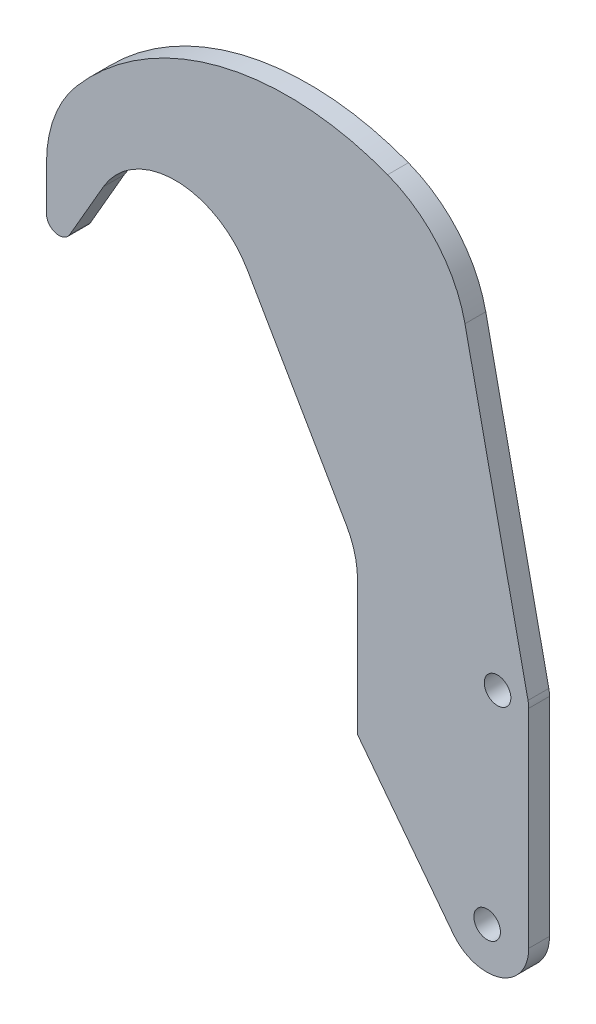
ISO-10303-21;
HEADER;
FILE_DESCRIPTION(('STEP AP214'),'2;1');
FILE_NAME('part.step','',(''),(''),'','','');
FILE_SCHEMA(('AUTOMOTIVE_DESIGN { 1 0 10303 214 1 1 1 1 }'));
ENDSEC;
DATA;
#1=APPLICATION_CONTEXT('core data for automotive mechanical design processes');
#2=APPLICATION_PROTOCOL_DEFINITION('international standard','automotive_design',2000,#1);
#3=PRODUCT_CONTEXT('',#1,'mechanical');
#4=PRODUCT('Part','Part','',(#3));
#5=PRODUCT_RELATED_PRODUCT_CATEGORY('part','',(#4));
#6=PRODUCT_DEFINITION_FORMATION('','',#4);
#7=PRODUCT_DEFINITION_CONTEXT('part definition',#1,'design');
#8=PRODUCT_DEFINITION('design','',#6,#7);
#9=PRODUCT_DEFINITION_SHAPE('','',#8);
#10=(LENGTH_UNIT() NAMED_UNIT(*) SI_UNIT(.MILLI.,.METRE.));
#11=(NAMED_UNIT(*) PLANE_ANGLE_UNIT() SI_UNIT($,.RADIAN.));
#12=(NAMED_UNIT(*) SI_UNIT($,.STERADIAN.) SOLID_ANGLE_UNIT());
#13=UNCERTAINTY_MEASURE_WITH_UNIT(LENGTH_MEASURE(1.E-05),#10,'distance_accuracy_value','');
#14=(GEOMETRIC_REPRESENTATION_CONTEXT(3) GLOBAL_UNCERTAINTY_ASSIGNED_CONTEXT((#13)) GLOBAL_UNIT_ASSIGNED_CONTEXT((#10,
#11,#12)) REPRESENTATION_CONTEXT('',''));
#15=CARTESIAN_POINT('',(0.,0.,0.));
#16=DIRECTION('',(0.,0.,1.));
#17=DIRECTION('',(1.,0.,0.));
#18=AXIS2_PLACEMENT_3D('',#15,#16,#17);
#19=CARTESIAN_POINT('',(0.,17.4624999999999,1.5875));
#20=DIRECTION('',(0.,0.,-1.));
#21=DIRECTION('',(-1.,0.,0.));
#22=AXIS2_PLACEMENT_3D('',#19,#20,#21);
#23=PLANE('',#22);
#24=CARTESIAN_POINT('',(17.2053312406606,7.3827663145275,1.5875));
#25=DIRECTION('',(0.,0.,1.));
#26=DIRECTION('',(-1.,0.,0.));
#27=AXIS2_PLACEMENT_3D('',#24,#25,#26);
#28=CIRCLE('',#27,42.5449999999998);
#29=CARTESIAN_POINT('',(32.4221997439298,47.1134086193556,1.5875));
#30=VERTEX_POINT('',#29);
#31=CARTESIAN_POINT('',(-15.1018445013364,35.0653135343139,1.5875));
#32=VERTEX_POINT('',#31);
#33=EDGE_CURVE('E257',#30,#32,#28,.T.);
#34=ORIENTED_EDGE('',*,*,#33,.T.);
#35=CARTESIAN_POINT('',(-0.635944915367502,22.6701431373946,1.5875));
#36=DIRECTION('',(0.,0.,-1.));
#37=DIRECTION('',(-1.,0.,0.));
#38=AXIS2_PLACEMENT_3D('',#35,#36,#37);
#39=CIRCLE('',#38,19.05);
#40=CARTESIAN_POINT('',(-19.6859449153675,22.6701431373947,1.5875));
#41=VERTEX_POINT('',#40);
#42=EDGE_CURVE('E54',#32,#41,#39,.F.);
#43=ORIENTED_EDGE('',*,*,#42,.T.);
#44=DIRECTION('',(0.,-1.,0.));
#45=VECTOR('',#44,1.);
#46=CARTESIAN_POINT('',(-19.6859449153676,15.875,1.5875));
#47=LINE('',#46,#45);
#48=CARTESIAN_POINT('',(-19.6859449153676,15.875,1.5875));
#49=VERTEX_POINT('',#48);
#50=EDGE_CURVE('E255',#41,#49,#47,.T.);
#51=ORIENTED_EDGE('',*,*,#50,.T.);
#52=CARTESIAN_POINT('',(-17.7809449153676,15.875,1.5875));
#53=DIRECTION('',(0.,0.,1.));
#54=DIRECTION('',(1.,0.,0.));
#55=AXIS2_PLACEMENT_3D('',#52,#53,#54);
#56=CIRCLE('',#55,1.905);
#57=CARTESIAN_POINT('',(-16.1311665211582,14.9225,1.5875));
#58=VERTEX_POINT('',#57);
#59=EDGE_CURVE('E267',#49,#58,#56,.T.);
#60=ORIENTED_EDGE('',*,*,#59,.T.);
#61=DIRECTION('',(0.5,0.866025403784439,0.));
#62=VECTOR('',#61,1.);
#63=CARTESIAN_POINT('',(-10.9985226280624,23.8125,1.5875));
#64=LINE('',#63,#62);
#65=CARTESIAN_POINT('',(-10.9985226280624,23.8125,1.5875));
#66=VERTEX_POINT('',#65);
#67=EDGE_CURVE('E216',#58,#66,#64,.T.);
#68=ORIENTED_EDGE('',*,*,#67,.T.);
#69=CARTESIAN_POINT('',(0.,17.4624999999999,1.5875));
#70=DIRECTION('',(0.,0.,-1.));
#71=DIRECTION('',(-1.,0.,0.));
#72=AXIS2_PLACEMENT_3D('',#69,#70,#71);
#73=CIRCLE('',#72,12.7000000000001);
#74=CARTESIAN_POINT('',(10.9985226280624,23.8125,1.5875));
#75=VERTEX_POINT('',#74);
#76=EDGE_CURVE('E211',#66,#75,#73,.T.);
#77=ORIENTED_EDGE('',*,*,#76,.T.);
#78=DIRECTION('',(0.5,-0.866025403784439,0.));
#79=VECTOR('',#78,1.);
#80=CARTESIAN_POINT('',(10.9985226280624,23.8125,1.5875));
#81=LINE('',#80,#79);
#82=CARTESIAN_POINT('',(26.1214912416482,-2.38124999999995,1.5875));
#83=VERTEX_POINT('',#82);
#84=EDGE_CURVE('E199',#75,#83,#81,.T.);
#85=ORIENTED_EDGE('',*,*,#84,.T.);
#86=CARTESIAN_POINT('',(15.1229686135858,-8.73124999999997,1.5875));
#87=DIRECTION('',(0.,0.,-1.));
#88=DIRECTION('',(-1.,0.,0.));
#89=AXIS2_PLACEMENT_3D('',#86,#87,#88);
#90=CIRCLE('',#89,12.7000000000001);
#91=CARTESIAN_POINT('',(27.8229686135858,-8.73124999999997,1.5875));
#92=VERTEX_POINT('',#91);
#93=EDGE_CURVE('E210',#83,#92,#90,.T.);
#94=ORIENTED_EDGE('',*,*,#93,.T.);
#95=DIRECTION('',(0.,-1.,0.));
#96=VECTOR('',#95,1.);
#97=CARTESIAN_POINT('',(27.8229686135859,-8.73124999999997,1.5875));
#98=LINE('',#97,#96);
#99=CARTESIAN_POINT('',(27.8229686135859,-29.2392709480561,1.5875));
#100=VERTEX_POINT('',#99);
#101=EDGE_CURVE('E342',#92,#100,#98,.T.);
#102=ORIENTED_EDGE('',*,*,#101,.T.);
#103=DIRECTION('',(0.608697073810369,-0.793402717624974,0.));
#104=VECTOR('',#103,1.);
#105=CARTESIAN_POINT('',(27.8229686135859,-29.2392709480561,1.5875));
#106=LINE('',#105,#104);
#107=CARTESIAN_POINT('',(42.458005798578,-48.3152264186958,1.5875));
#108=VERTEX_POINT('',#107);
#109=EDGE_CURVE('E396',#100,#108,#106,.T.);
#110=ORIENTED_EDGE('',*,*,#109,.T.);
#111=CARTESIAN_POINT('',(47.4961130554966,-44.45,1.5875));
#112=DIRECTION('',(0.,0.,1.));
#113=DIRECTION('',(1.,0.,0.));
#114=AXIS2_PLACEMENT_3D('',#111,#112,#113);
#115=CIRCLE('',#114,6.34999999999998);
#116=CARTESIAN_POINT('',(47.4961130554966,-50.8,1.5875));
#117=VERTEX_POINT('',#116);
#118=EDGE_CURVE('E400',#108,#117,#115,.T.);
#119=ORIENTED_EDGE('',*,*,#118,.T.);
#120=DIRECTION('',(1.,0.,0.));
#121=VECTOR('',#120,1.);
#122=CARTESIAN_POINT('',(47.625,-50.8,1.5875));
#123=LINE('',#122,#121);
#124=CARTESIAN_POINT('',(47.625,-50.8,1.5875));
#125=VERTEX_POINT('',#124);
#126=EDGE_CURVE('E403',#117,#125,#123,.T.);
#127=ORIENTED_EDGE('',*,*,#126,.T.);
#128=CARTESIAN_POINT('',(47.625,-44.45,1.5875));
#129=DIRECTION('',(0.,0.,1.));
#130=DIRECTION('',(1.,0.,0.));
#131=AXIS2_PLACEMENT_3D('',#128,#129,#130);
#132=CIRCLE('',#131,6.34999999999999);
#133=CARTESIAN_POINT('',(53.975,-44.45,1.5875));
#134=VERTEX_POINT('',#133);
#135=EDGE_CURVE('E406',#125,#134,#132,.T.);
#136=ORIENTED_EDGE('',*,*,#135,.T.);
#137=DIRECTION('',(0.,1.,0.));
#138=VECTOR('',#137,1.);
#139=CARTESIAN_POINT('',(53.975,-12.7,1.5875));
#140=LINE('',#139,#138);
#141=CARTESIAN_POINT('',(53.975,-12.7,1.5875));
#142=VERTEX_POINT('',#141);
#143=EDGE_CURVE('E409',#134,#142,#140,.T.);
#144=ORIENTED_EDGE('',*,*,#143,.T.);
#145=CARTESIAN_POINT('',(49.2125,-12.7,1.5875));
#146=DIRECTION('',(0.,0.,1.));
#147=DIRECTION('',(1.,0.,0.));
#148=AXIS2_PLACEMENT_3D('',#145,#146,#147);
#149=CIRCLE('',#148,4.7625);
#150=CARTESIAN_POINT('',(53.8695609453618,-11.7034110169252,1.5875));
#151=VERTEX_POINT('',#150);
#152=EDGE_CURVE('E384',#142,#151,#149,.T.);
#153=ORIENTED_EDGE('',*,*,#152,.T.);
#154=DIRECTION('',(-0.209257529254546,0.97786056595523,0.));
#155=VECTOR('',#154,1.);
#156=CARTESIAN_POINT('',(53.8695609453618,-11.7034110169252,1.5875));
#157=LINE('',#156,#155);
#158=CARTESIAN_POINT('',(44.2369203149579,33.3099247136719,1.5875));
#159=VERTEX_POINT('',#158);
#160=EDGE_CURVE('E379',#151,#159,#157,.T.);
#161=ORIENTED_EDGE('',*,*,#160,.T.);
#162=CARTESIAN_POINT('',(25.6086765335107,29.3235687813728,1.5875));
#163=DIRECTION('',(0.,0.,-1.));
#164=DIRECTION('',(-1.,0.,0.));
#165=AXIS2_PLACEMENT_3D('',#162,#163,#164);
#166=CIRCLE('',#165,19.05);
#167=EDGE_CURVE('E250',#159,#30,#166,.F.);
#168=ORIENTED_EDGE('',*,*,#167,.T.);
#169=EDGE_LOOP('',(#34,#43,#51,#60,#68,#77,#85,#94,#102,#110,#119,#127,#136,#144,#153,#161,#168));
#170=FACE_BOUND('',#169,.T.);
#171=CARTESIAN_POINT('',(49.2125,-12.7,1.5875));
#172=DIRECTION('',(0.,0.,1.));
#173=DIRECTION('',(1.,0.,0.));
#174=AXIS2_PLACEMENT_3D('',#171,#172,#173);
#175=CIRCLE('',#174,2.032);
#176=CARTESIAN_POINT('',(51.2445,-12.7,1.5875));
#177=VERTEX_POINT('',#176);
#178=EDGE_CURVE('E391',#177,#177,#175,.T.);
#179=ORIENTED_EDGE('',*,*,#178,.F.);
#180=EDGE_LOOP('',(#179));
#181=FACE_BOUND('',#180,.T.);
#182=CARTESIAN_POINT('',(47.625,-44.45,1.5875));
#183=DIRECTION('',(0.,0.,1.));
#184=DIRECTION('',(1.,0.,0.));
#185=AXIS2_PLACEMENT_3D('',#182,#183,#184);
#186=CIRCLE('',#185,2.03200000000001);
#187=CARTESIAN_POINT('',(49.657,-44.45,1.5875));
#188=VERTEX_POINT('',#187);
#189=EDGE_CURVE('E616',#188,#188,#186,.T.);
#190=ORIENTED_EDGE('',*,*,#189,.F.);
#191=EDGE_LOOP('',(#190));
#192=FACE_BOUND('',#191,.T.);
#193=ADVANCED_FACE('F45',(#170,#181,#192),#23,.F.);
#194=CARTESIAN_POINT('',(0.,17.4624999999999,-1.5875));
#195=DIRECTION('',(0.,0.,-1.));
#196=DIRECTION('',(-1.,0.,0.));
#197=AXIS2_PLACEMENT_3D('',#194,#195,#196);
#198=PLANE('',#197);
#199=CARTESIAN_POINT('',(49.2125,-12.7,-1.5875));
#200=DIRECTION('',(0.,0.,1.));
#201=DIRECTION('',(1.,0.,0.));
#202=AXIS2_PLACEMENT_3D('',#199,#200,#201);
#203=CIRCLE('',#202,2.032);
#204=CARTESIAN_POINT('',(51.2445,-12.7,-1.5875));
#205=VERTEX_POINT('',#204);
#206=EDGE_CURVE('E623',#205,#205,#203,.T.);
#207=ORIENTED_EDGE('',*,*,#206,.T.);
#208=EDGE_LOOP('',(#207));
#209=FACE_BOUND('',#208,.T.);
#210=DIRECTION('',(0.,-1.,0.));
#211=VECTOR('',#210,1.);
#212=CARTESIAN_POINT('',(-19.6859449153676,15.875,-1.5875));
#213=LINE('',#212,#211);
#214=CARTESIAN_POINT('',(-19.6859449153675,22.6701431373947,-1.5875));
#215=VERTEX_POINT('',#214);
#216=CARTESIAN_POINT('',(-19.6859449153676,15.875,-1.5875));
#217=VERTEX_POINT('',#216);
#218=EDGE_CURVE('E276',#215,#217,#213,.T.);
#219=ORIENTED_EDGE('',*,*,#218,.F.);
#220=CARTESIAN_POINT('',(-0.635944915367502,22.6701431373946,-1.5875));
#221=DIRECTION('',(0.,0.,-1.));
#222=DIRECTION('',(-1.,0.,0.));
#223=AXIS2_PLACEMENT_3D('',#220,#221,#222);
#224=CIRCLE('',#223,19.05);
#225=CARTESIAN_POINT('',(-15.1018445013364,35.0653135343139,-1.5875));
#226=VERTEX_POINT('',#225);
#227=EDGE_CURVE('E241',#215,#226,#224,.T.);
#228=ORIENTED_EDGE('',*,*,#227,.T.);
#229=CARTESIAN_POINT('',(17.2053312406606,7.3827663145275,-1.5875));
#230=DIRECTION('',(0.,0.,1.));
#231=DIRECTION('',(-1.,0.,0.));
#232=AXIS2_PLACEMENT_3D('',#229,#230,#231);
#233=CIRCLE('',#232,42.5449999999998);
#234=CARTESIAN_POINT('',(32.4221997439298,47.1134086193556,-1.5875));
#235=VERTEX_POINT('',#234);
#236=EDGE_CURVE('E274',#235,#226,#233,.T.);
#237=ORIENTED_EDGE('',*,*,#236,.F.);
#238=CARTESIAN_POINT('',(25.6086765335107,29.3235687813728,-1.5875));
#239=DIRECTION('',(0.,0.,-1.));
#240=DIRECTION('',(-1.,0.,0.));
#241=AXIS2_PLACEMENT_3D('',#238,#239,#240);
#242=CIRCLE('',#241,19.05);
#243=CARTESIAN_POINT('',(44.2369203149579,33.3099247136719,-1.5875));
#244=VERTEX_POINT('',#243);
#245=EDGE_CURVE('E232',#235,#244,#242,.T.);
#246=ORIENTED_EDGE('',*,*,#245,.T.);
#247=DIRECTION('',(-0.209257529254546,0.97786056595523,0.));
#248=VECTOR('',#247,1.);
#249=CARTESIAN_POINT('',(53.8695609453618,-11.7034110169252,-1.5875));
#250=LINE('',#249,#248);
#251=CARTESIAN_POINT('',(53.8695609453618,-11.7034110169252,-1.5875));
#252=VERTEX_POINT('',#251);
#253=EDGE_CURVE('E280',#252,#244,#250,.T.);
#254=ORIENTED_EDGE('',*,*,#253,.F.);
#255=CARTESIAN_POINT('',(49.2125,-12.7,-1.5875));
#256=DIRECTION('',(0.,0.,1.));
#257=DIRECTION('',(1.,0.,0.));
#258=AXIS2_PLACEMENT_3D('',#255,#256,#257);
#259=CIRCLE('',#258,4.7625);
#260=CARTESIAN_POINT('',(53.975,-12.7,-1.5875));
#261=VERTEX_POINT('',#260);
#262=EDGE_CURVE('E287',#261,#252,#259,.T.);
#263=ORIENTED_EDGE('',*,*,#262,.F.);
#264=DIRECTION('',(0.,1.,0.));
#265=VECTOR('',#264,1.);
#266=CARTESIAN_POINT('',(53.975,-12.7,-1.5875));
#267=LINE('',#266,#265);
#268=CARTESIAN_POINT('',(53.975,-44.45,-1.5875));
#269=VERTEX_POINT('',#268);
#270=EDGE_CURVE('E367',#269,#261,#267,.T.);
#271=ORIENTED_EDGE('',*,*,#270,.F.);
#272=CARTESIAN_POINT('',(47.625,-44.45,-1.5875));
#273=DIRECTION('',(0.,0.,1.));
#274=DIRECTION('',(1.,0.,0.));
#275=AXIS2_PLACEMENT_3D('',#272,#273,#274);
#276=CIRCLE('',#275,6.34999999999999);
#277=CARTESIAN_POINT('',(47.625,-50.8,-1.5875));
#278=VERTEX_POINT('',#277);
#279=EDGE_CURVE('E364',#278,#269,#276,.T.);
#280=ORIENTED_EDGE('',*,*,#279,.F.);
#281=DIRECTION('',(1.,0.,0.));
#282=VECTOR('',#281,1.);
#283=CARTESIAN_POINT('',(47.625,-50.8,-1.5875));
#284=LINE('',#283,#282);
#285=CARTESIAN_POINT('',(47.4961130554966,-50.8,-1.5875));
#286=VERTEX_POINT('',#285);
#287=EDGE_CURVE('E361',#286,#278,#284,.T.);
#288=ORIENTED_EDGE('',*,*,#287,.F.);
#289=CARTESIAN_POINT('',(47.4961130554966,-44.45,-1.5875));
#290=DIRECTION('',(0.,0.,1.));
#291=DIRECTION('',(1.,0.,0.));
#292=AXIS2_PLACEMENT_3D('',#289,#290,#291);
#293=CIRCLE('',#292,6.34999999999998);
#294=CARTESIAN_POINT('',(42.458005798578,-48.3152264186958,-1.5875));
#295=VERTEX_POINT('',#294);
#296=EDGE_CURVE('E353',#295,#286,#293,.T.);
#297=ORIENTED_EDGE('',*,*,#296,.F.);
#298=DIRECTION('',(0.608697073810369,-0.793402717624974,0.));
#299=VECTOR('',#298,1.);
#300=CARTESIAN_POINT('',(27.8229686135859,-29.2392709480561,-1.5875));
#301=LINE('',#300,#299);
#302=CARTESIAN_POINT('',(27.8229686135859,-29.2392709480561,-1.5875));
#303=VERTEX_POINT('',#302);
#304=EDGE_CURVE('E348',#303,#295,#301,.T.);
#305=ORIENTED_EDGE('',*,*,#304,.F.);
#306=DIRECTION('',(0.,-1.,0.));
#307=VECTOR('',#306,1.);
#308=CARTESIAN_POINT('',(27.8229686135859,-8.73124999999997,-1.5875));
#309=LINE('',#308,#307);
#310=CARTESIAN_POINT('',(27.8229686135858,-8.73124999999997,-1.5875));
#311=VERTEX_POINT('',#310);
#312=EDGE_CURVE('E341',#311,#303,#309,.T.);
#313=ORIENTED_EDGE('',*,*,#312,.F.);
#314=CARTESIAN_POINT('',(15.1229686135858,-8.73124999999997,-1.5875));
#315=DIRECTION('',(0.,0.,-1.));
#316=DIRECTION('',(-1.,0.,0.));
#317=AXIS2_PLACEMENT_3D('',#314,#315,#316);
#318=CIRCLE('',#317,12.7000000000001);
#319=CARTESIAN_POINT('',(26.1214912416482,-2.38124999999995,-1.5875));
#320=VERTEX_POINT('',#319);
#321=EDGE_CURVE('E346',#320,#311,#318,.T.);
#322=ORIENTED_EDGE('',*,*,#321,.F.);
#323=DIRECTION('',(0.5,-0.866025403784439,0.));
#324=VECTOR('',#323,1.);
#325=CARTESIAN_POINT('',(10.9985226280624,23.8125,-1.5875));
#326=LINE('',#325,#324);
#327=CARTESIAN_POINT('',(10.9985226280624,23.8125,-1.5875));
#328=VERTEX_POINT('',#327);
#329=EDGE_CURVE('E355',#328,#320,#326,.T.);
#330=ORIENTED_EDGE('',*,*,#329,.F.);
#331=CARTESIAN_POINT('',(0.,17.4624999999999,-1.5875));
#332=DIRECTION('',(0.,0.,-1.));
#333=DIRECTION('',(-1.,0.,0.));
#334=AXIS2_PLACEMENT_3D('',#331,#332,#333);
#335=CIRCLE('',#334,12.7000000000001);
#336=CARTESIAN_POINT('',(-10.9985226280624,23.8125,-1.5875));
#337=VERTEX_POINT('',#336);
#338=EDGE_CURVE('E225',#337,#328,#335,.T.);
#339=ORIENTED_EDGE('',*,*,#338,.F.);
#340=DIRECTION('',(0.5,0.866025403784439,0.));
#341=VECTOR('',#340,1.);
#342=CARTESIAN_POINT('',(-10.9985226280624,23.8125,-1.5875));
#343=LINE('',#342,#341);
#344=CARTESIAN_POINT('',(-16.1311665211582,14.9225,-1.5875));
#345=VERTEX_POINT('',#344);
#346=EDGE_CURVE('E221',#345,#337,#343,.T.);
#347=ORIENTED_EDGE('',*,*,#346,.F.);
#348=CARTESIAN_POINT('',(-17.7809449153676,15.875,-1.5875));
#349=DIRECTION('',(0.,0.,1.));
#350=DIRECTION('',(1.,0.,0.));
#351=AXIS2_PLACEMENT_3D('',#348,#349,#350);
#352=CIRCLE('',#351,1.905);
#353=EDGE_CURVE('E284',#217,#345,#352,.T.);
#354=ORIENTED_EDGE('',*,*,#353,.F.);
#355=EDGE_LOOP('',(#219,#228,#237,#246,#254,#263,#271,#280,#288,#297,#305,#313,#322,#330,#339,
#347,#354));
#356=FACE_BOUND('',#355,.T.);
#357=CARTESIAN_POINT('',(47.625,-44.45,-1.5875));
#358=DIRECTION('',(0.,0.,1.));
#359=DIRECTION('',(1.,0.,0.));
#360=AXIS2_PLACEMENT_3D('',#357,#358,#359);
#361=CIRCLE('',#360,2.03200000000001);
#362=CARTESIAN_POINT('',(49.657,-44.45,-1.5875));
#363=VERTEX_POINT('',#362);
#364=EDGE_CURVE('E619',#363,#363,#361,.T.);
#365=ORIENTED_EDGE('',*,*,#364,.T.);
#366=EDGE_LOOP('',(#365));
#367=FACE_BOUND('',#366,.T.);
#368=ADVANCED_FACE('F272',(#209,#356,#367),#198,.T.);
#369=CARTESIAN_POINT('',(0.,17.4624999999999,1.5875));
#370=DIRECTION('',(0.,0.,-1.));
#371=DIRECTION('',(-1.,0.,0.));
#372=AXIS2_PLACEMENT_3D('',#369,#370,#371);
#373=CYLINDRICAL_SURFACE('',#372,12.7000000000001);
#374=ORIENTED_EDGE('',*,*,#338,.T.);
#375=DIRECTION('',(0.,0.,-1.));
#376=VECTOR('',#375,1.);
#377=CARTESIAN_POINT('',(10.9985226280624,23.8125,1.5875));
#378=LINE('',#377,#376);
#379=EDGE_CURVE('E203',#75,#328,#378,.T.);
#380=ORIENTED_EDGE('',*,*,#379,.F.);
#381=ORIENTED_EDGE('',*,*,#76,.F.);
#382=DIRECTION('',(0.,0.,-1.));
#383=VECTOR('',#382,1.);
#384=CARTESIAN_POINT('',(-10.9985226280624,23.8125,1.5875));
#385=LINE('',#384,#383);
#386=EDGE_CURVE('E295',#66,#337,#385,.T.);
#387=ORIENTED_EDGE('',*,*,#386,.T.);
#388=EDGE_LOOP('',(#374,#380,#381,#387));
#389=FACE_BOUND('',#388,.T.);
#390=ADVANCED_FACE('F223',(#389),#373,.F.);
#391=CARTESIAN_POINT('',(10.9985226280624,23.8125,1.5875));
#392=DIRECTION('',(0.866025403784439,0.5,0.));
#393=DIRECTION('',(-0.5,0.866025403784439,0.));
#394=AXIS2_PLACEMENT_3D('',#391,#392,#393);
#395=PLANE('',#394);
#396=ORIENTED_EDGE('',*,*,#329,.T.);
#397=DIRECTION('',(0.,0.,-1.));
#398=VECTOR('',#397,1.);
#399=CARTESIAN_POINT('',(26.1214912416482,-2.38124999999995,1.5875));
#400=LINE('',#399,#398);
#401=EDGE_CURVE('E206',#83,#320,#400,.T.);
#402=ORIENTED_EDGE('',*,*,#401,.F.);
#403=ORIENTED_EDGE('',*,*,#84,.F.);
#404=ORIENTED_EDGE('',*,*,#379,.T.);
#405=EDGE_LOOP('',(#396,#402,#403,#404));
#406=FACE_BOUND('',#405,.T.);
#407=ADVANCED_FACE('F201',(#406),#395,.F.);
#408=CARTESIAN_POINT('',(15.1229686135858,-8.73124999999997,1.5875));
#409=DIRECTION('',(0.,0.,-1.));
#410=DIRECTION('',(-1.,0.,0.));
#411=AXIS2_PLACEMENT_3D('',#408,#409,#410);
#412=CYLINDRICAL_SURFACE('',#411,12.7000000000001);
#413=ORIENTED_EDGE('',*,*,#321,.T.);
#414=DIRECTION('',(0.,0.,-1.));
#415=VECTOR('',#414,1.);
#416=CARTESIAN_POINT('',(27.8229686135858,-8.73124999999997,1.5875));
#417=LINE('',#416,#415);
#418=EDGE_CURVE('E235',#92,#311,#417,.T.);
#419=ORIENTED_EDGE('',*,*,#418,.F.);
#420=ORIENTED_EDGE('',*,*,#93,.F.);
#421=ORIENTED_EDGE('',*,*,#401,.T.);
#422=EDGE_LOOP('',(#413,#419,#420,#421));
#423=FACE_BOUND('',#422,.T.);
#424=ADVANCED_FACE('F393',(#423),#412,.F.);
#425=CARTESIAN_POINT('',(27.8229686135859,-8.73124999999997,1.5875));
#426=DIRECTION('',(1.,0.,0.));
#427=DIRECTION('',(0.,0.,-1.));
#428=AXIS2_PLACEMENT_3D('',#425,#426,#427);
#429=PLANE('',#428);
#430=ORIENTED_EDGE('',*,*,#312,.T.);
#431=DIRECTION('',(0.,0.,-1.));
#432=VECTOR('',#431,1.);
#433=CARTESIAN_POINT('',(27.8229686135859,-29.2392709480561,1.5875));
#434=LINE('',#433,#432);
#435=EDGE_CURVE('E328',#100,#303,#434,.T.);
#436=ORIENTED_EDGE('',*,*,#435,.F.);
#437=ORIENTED_EDGE('',*,*,#101,.F.);
#438=ORIENTED_EDGE('',*,*,#418,.T.);
#439=EDGE_LOOP('',(#430,#436,#437,#438));
#440=FACE_BOUND('',#439,.T.);
#441=ADVANCED_FACE('F339',(#440),#429,.F.);
#442=CARTESIAN_POINT('',(27.8229686135859,-29.2392709480561,1.5875));
#443=DIRECTION('',(0.793402717624974,0.608697073810369,0.));
#444=DIRECTION('',(-0.608697073810369,0.793402717624974,0.));
#445=AXIS2_PLACEMENT_3D('',#442,#443,#444);
#446=PLANE('',#445);
#447=ORIENTED_EDGE('',*,*,#304,.T.);
#448=DIRECTION('',(0.,0.,-1.));
#449=VECTOR('',#448,1.);
#450=CARTESIAN_POINT('',(42.458005798578,-48.3152264186958,1.5875));
#451=LINE('',#450,#449);
#452=EDGE_CURVE('E324',#108,#295,#451,.T.);
#453=ORIENTED_EDGE('',*,*,#452,.F.);
#454=ORIENTED_EDGE('',*,*,#109,.F.);
#455=ORIENTED_EDGE('',*,*,#435,.T.);
#456=EDGE_LOOP('',(#447,#453,#454,#455));
#457=FACE_BOUND('',#456,.T.);
#458=ADVANCED_FACE('F433',(#457),#446,.F.);
#459=CARTESIAN_POINT('',(47.4961130554966,-44.45,1.5875));
#460=DIRECTION('',(0.,0.,-1.));
#461=DIRECTION('',(-1.,0.,0.));
#462=AXIS2_PLACEMENT_3D('',#459,#460,#461);
#463=CYLINDRICAL_SURFACE('',#462,6.34999999999998);
#464=ORIENTED_EDGE('',*,*,#296,.T.);
#465=DIRECTION('',(0.,0.,-1.));
#466=VECTOR('',#465,1.);
#467=CARTESIAN_POINT('',(47.4961130554966,-50.8,1.5875));
#468=LINE('',#467,#466);
#469=EDGE_CURVE('E320',#117,#286,#468,.T.);
#470=ORIENTED_EDGE('',*,*,#469,.F.);
#471=ORIENTED_EDGE('',*,*,#118,.F.);
#472=ORIENTED_EDGE('',*,*,#452,.T.);
#473=EDGE_LOOP('',(#464,#470,#471,#472));
#474=FACE_BOUND('',#473,.T.);
#475=ADVANCED_FACE('F429',(#474),#463,.T.);
#476=CARTESIAN_POINT('',(47.625,-50.8,1.5875));
#477=DIRECTION('',(0.,1.,0.));
#478=DIRECTION('',(-1.,0.,0.));
#479=AXIS2_PLACEMENT_3D('',#476,#477,#478);
#480=PLANE('',#479);
#481=ORIENTED_EDGE('',*,*,#287,.T.);
#482=DIRECTION('',(0.,0.,-1.));
#483=VECTOR('',#482,1.);
#484=CARTESIAN_POINT('',(47.625,-50.8,1.5875));
#485=LINE('',#484,#483);
#486=EDGE_CURVE('E316',#125,#278,#485,.T.);
#487=ORIENTED_EDGE('',*,*,#486,.F.);
#488=ORIENTED_EDGE('',*,*,#126,.F.);
#489=ORIENTED_EDGE('',*,*,#469,.T.);
#490=EDGE_LOOP('',(#481,#487,#488,#489));
#491=FACE_BOUND('',#490,.T.);
#492=ADVANCED_FACE('F425',(#491),#480,.F.);
#493=CARTESIAN_POINT('',(47.625,-44.45,1.5875));
#494=DIRECTION('',(0.,0.,-1.));
#495=DIRECTION('',(-1.,0.,0.));
#496=AXIS2_PLACEMENT_3D('',#493,#494,#495);
#497=CYLINDRICAL_SURFACE('',#496,6.34999999999999);
#498=ORIENTED_EDGE('',*,*,#279,.T.);
#499=DIRECTION('',(0.,0.,-1.));
#500=VECTOR('',#499,1.);
#501=CARTESIAN_POINT('',(53.975,-44.45,1.5875));
#502=LINE('',#501,#500);
#503=EDGE_CURVE('E312',#134,#269,#502,.T.);
#504=ORIENTED_EDGE('',*,*,#503,.F.);
#505=ORIENTED_EDGE('',*,*,#135,.F.);
#506=ORIENTED_EDGE('',*,*,#486,.T.);
#507=EDGE_LOOP('',(#498,#504,#505,#506));
#508=FACE_BOUND('',#507,.T.);
#509=ADVANCED_FACE('F421',(#508),#497,.T.);
#510=CARTESIAN_POINT('',(53.975,-12.7,1.5875));
#511=DIRECTION('',(-1.,0.,0.));
#512=DIRECTION('',(0.,-1.,0.));
#513=AXIS2_PLACEMENT_3D('',#510,#511,#512);
#514=PLANE('',#513);
#515=ORIENTED_EDGE('',*,*,#270,.T.);
#516=DIRECTION('',(0.,0.,-1.));
#517=VECTOR('',#516,1.);
#518=CARTESIAN_POINT('',(53.975,-12.7,1.5875));
#519=LINE('',#518,#517);
#520=EDGE_CURVE('E308',#142,#261,#519,.T.);
#521=ORIENTED_EDGE('',*,*,#520,.F.);
#522=ORIENTED_EDGE('',*,*,#143,.F.);
#523=ORIENTED_EDGE('',*,*,#503,.T.);
#524=EDGE_LOOP('',(#515,#521,#522,#523));
#525=FACE_BOUND('',#524,.T.);
#526=ADVANCED_FACE('F417',(#525),#514,.F.);
#527=CARTESIAN_POINT('',(49.2125,-12.7,1.5875));
#528=DIRECTION('',(0.,0.,-1.));
#529=DIRECTION('',(-1.,0.,0.));
#530=AXIS2_PLACEMENT_3D('',#527,#528,#529);
#531=CYLINDRICAL_SURFACE('',#530,4.7625);
#532=ORIENTED_EDGE('',*,*,#262,.T.);
#533=DIRECTION('',(0.,0.,-1.));
#534=VECTOR('',#533,1.);
#535=CARTESIAN_POINT('',(53.8695609453618,-11.7034110169252,1.5875));
#536=LINE('',#535,#534);
#537=EDGE_CURVE('E304',#151,#252,#536,.T.);
#538=ORIENTED_EDGE('',*,*,#537,.F.);
#539=ORIENTED_EDGE('',*,*,#152,.F.);
#540=ORIENTED_EDGE('',*,*,#520,.T.);
#541=EDGE_LOOP('',(#532,#538,#539,#540));
#542=FACE_BOUND('',#541,.T.);
#543=ADVANCED_FACE('F373',(#542),#531,.T.);
#544=CARTESIAN_POINT('',(53.8695609453618,-11.7034110169252,1.5875));
#545=DIRECTION('',(-0.97786056595523,-0.209257529254546,0.));
#546=DIRECTION('',(0.209257529254546,-0.97786056595523,0.));
#547=AXIS2_PLACEMENT_3D('',#544,#545,#546);
#548=PLANE('',#547);
#549=ORIENTED_EDGE('',*,*,#253,.T.);
#550=DIRECTION('',(0.,0.,-1.));
#551=VECTOR('',#550,1.);
#552=CARTESIAN_POINT('',(44.2369203149579,33.3099247136719,1.5875));
#553=LINE('',#552,#551);
#554=EDGE_CURVE('E11',#244,#159,#553,.F.);
#555=ORIENTED_EDGE('',*,*,#554,.T.);
#556=ORIENTED_EDGE('',*,*,#160,.F.);
#557=ORIENTED_EDGE('',*,*,#537,.T.);
#558=EDGE_LOOP('',(#549,#555,#556,#557));
#559=FACE_BOUND('',#558,.T.);
#560=ADVANCED_FACE('F378',(#559),#548,.F.);
#561=CARTESIAN_POINT('',(17.2053312406606,7.3827663145275,1.5875));
#562=DIRECTION('',(0.,0.,-1.));
#563=DIRECTION('',(-1.,0.,0.));
#564=AXIS2_PLACEMENT_3D('',#561,#562,#563);
#565=CYLINDRICAL_SURFACE('',#564,42.5449999999998);
#566=ORIENTED_EDGE('',*,*,#236,.T.);
#567=DIRECTION('',(0.,0.,-1.));
#568=VECTOR('',#567,1.);
#569=CARTESIAN_POINT('',(-15.1018445013364,35.0653135343139,1.5875));
#570=LINE('',#569,#568);
#571=EDGE_CURVE('E73',#226,#32,#570,.F.);
#572=ORIENTED_EDGE('',*,*,#571,.T.);
#573=ORIENTED_EDGE('',*,*,#33,.F.);
#574=DIRECTION('',(0.,0.,-1.));
#575=VECTOR('',#574,1.);
#576=CARTESIAN_POINT('',(32.4221997439298,47.1134086193556,1.5875));
#577=LINE('',#576,#575);
#578=EDGE_CURVE('E244',#30,#235,#577,.T.);
#579=ORIENTED_EDGE('',*,*,#578,.T.);
#580=EDGE_LOOP('',(#566,#572,#573,#579));
#581=FACE_BOUND('',#580,.T.);
#582=ADVANCED_FACE('F277',(#581),#565,.T.);
#583=CARTESIAN_POINT('',(-19.6859449153676,15.875,1.5875));
#584=DIRECTION('',(1.,0.,0.));
#585=DIRECTION('',(0.,1.,0.));
#586=AXIS2_PLACEMENT_3D('',#583,#584,#585);
#587=PLANE('',#586);
#588=ORIENTED_EDGE('',*,*,#50,.F.);
#589=DIRECTION('',(0.,0.,-1.));
#590=VECTOR('',#589,1.);
#591=CARTESIAN_POINT('',(-19.6859449153675,22.6701431373947,1.5875));
#592=LINE('',#591,#590);
#593=EDGE_CURVE('E227',#41,#215,#592,.T.);
#594=ORIENTED_EDGE('',*,*,#593,.T.);
#595=ORIENTED_EDGE('',*,*,#218,.T.);
#596=DIRECTION('',(0.,0.,-1.));
#597=VECTOR('',#596,1.);
#598=CARTESIAN_POINT('',(-19.6859449153676,15.875,1.5875));
#599=LINE('',#598,#597);
#600=EDGE_CURVE('E264',#49,#217,#599,.T.);
#601=ORIENTED_EDGE('',*,*,#600,.F.);
#602=EDGE_LOOP('',(#588,#594,#595,#601));
#603=FACE_BOUND('',#602,.T.);
#604=ADVANCED_FACE('F261',(#603),#587,.F.);
#605=CARTESIAN_POINT('',(-17.7809449153676,15.875,1.5875));
#606=DIRECTION('',(0.,0.,-1.));
#607=DIRECTION('',(-1.,0.,0.));
#608=AXIS2_PLACEMENT_3D('',#605,#606,#607);
#609=CYLINDRICAL_SURFACE('',#608,1.905);
#610=ORIENTED_EDGE('',*,*,#353,.T.);
#611=DIRECTION('',(0.,0.,-1.));
#612=VECTOR('',#611,1.);
#613=CARTESIAN_POINT('',(-16.1311665211582,14.9225,1.5875));
#614=LINE('',#613,#612);
#615=EDGE_CURVE('E298',#58,#345,#614,.T.);
#616=ORIENTED_EDGE('',*,*,#615,.F.);
#617=ORIENTED_EDGE('',*,*,#59,.F.);
#618=ORIENTED_EDGE('',*,*,#600,.T.);
#619=EDGE_LOOP('',(#610,#616,#617,#618));
#620=FACE_BOUND('',#619,.T.);
#621=ADVANCED_FACE('F455',(#620),#609,.T.);
#622=CARTESIAN_POINT('',(-10.9985226280624,23.8125,1.5875));
#623=DIRECTION('',(-0.866025403784439,0.5,0.));
#624=DIRECTION('',(-0.5,-0.866025403784439,0.));
#625=AXIS2_PLACEMENT_3D('',#622,#623,#624);
#626=PLANE('',#625);
#627=ORIENTED_EDGE('',*,*,#346,.T.);
#628=ORIENTED_EDGE('',*,*,#386,.F.);
#629=ORIENTED_EDGE('',*,*,#67,.F.);
#630=ORIENTED_EDGE('',*,*,#615,.T.);
#631=EDGE_LOOP('',(#627,#628,#629,#630));
#632=FACE_BOUND('',#631,.T.);
#633=ADVANCED_FACE('F452',(#632),#626,.F.);
#634=CARTESIAN_POINT('',(49.2125,-12.7,1.5875));
#635=DIRECTION('',(0.,0.,-1.));
#636=DIRECTION('',(-1.,0.,0.));
#637=AXIS2_PLACEMENT_3D('',#634,#635,#636);
#638=CYLINDRICAL_SURFACE('',#637,2.032);
#639=ORIENTED_EDGE('',*,*,#178,.T.);
#640=EDGE_LOOP('',(#639));
#641=FACE_BOUND('',#640,.T.);
#642=ORIENTED_EDGE('',*,*,#206,.F.);
#643=EDGE_LOOP('',(#642));
#644=FACE_BOUND('',#643,.T.);
#645=ADVANCED_FACE('F449',(#641,#644),#638,.F.);
#646=CARTESIAN_POINT('',(47.625,-44.45,1.5875));
#647=DIRECTION('',(0.,0.,-1.));
#648=DIRECTION('',(-1.,0.,0.));
#649=AXIS2_PLACEMENT_3D('',#646,#647,#648);
#650=CYLINDRICAL_SURFACE('',#649,2.03200000000001);
#651=ORIENTED_EDGE('',*,*,#189,.T.);
#652=EDGE_LOOP('',(#651));
#653=FACE_BOUND('',#652,.T.);
#654=ORIENTED_EDGE('',*,*,#364,.F.);
#655=EDGE_LOOP('',(#654));
#656=FACE_BOUND('',#655,.T.);
#657=ADVANCED_FACE('F513',(#653,#656),#650,.F.);
#658=CARTESIAN_POINT('',(-0.635944915367502,22.6701431373946,1.5875));
#659=DIRECTION('',(0.,0.,-1.));
#660=DIRECTION('',(-1.,0.,0.));
#661=AXIS2_PLACEMENT_3D('',#658,#659,#660);
#662=CYLINDRICAL_SURFACE('',#661,19.05);
#663=ORIENTED_EDGE('',*,*,#42,.F.);
#664=ORIENTED_EDGE('',*,*,#571,.F.);
#665=ORIENTED_EDGE('',*,*,#227,.F.);
#666=ORIENTED_EDGE('',*,*,#593,.F.);
#667=EDGE_LOOP('',(#663,#664,#665,#666));
#668=FACE_BOUND('',#667,.T.);
#669=ADVANCED_FACE('F269',(#668),#662,.T.);
#670=CARTESIAN_POINT('',(25.6086765335107,29.3235687813728,1.5875));
#671=DIRECTION('',(0.,0.,-1.));
#672=DIRECTION('',(-1.,0.,0.));
#673=AXIS2_PLACEMENT_3D('',#670,#671,#672);
#674=CYLINDRICAL_SURFACE('',#673,19.05);
#675=ORIENTED_EDGE('',*,*,#167,.F.);
#676=ORIENTED_EDGE('',*,*,#554,.F.);
#677=ORIENTED_EDGE('',*,*,#245,.F.);
#678=ORIENTED_EDGE('',*,*,#578,.F.);
#679=EDGE_LOOP('',(#675,#676,#677,#678));
#680=FACE_BOUND('',#679,.T.);
#681=ADVANCED_FACE('F47',(#680),#674,.T.);
#682=CLOSED_SHELL('',(#193,#368,#390,#407,#424,#441,#458,#475,#492,#509,#526,#543,#560,#582,
#604,#621,#633,#645,#657,#669,#681));
#683=MANIFOLD_SOLID_BREP('B2',#682);
#684=ADVANCED_BREP_SHAPE_REPRESENTATION('',(#18,#683),#14);
#685=SHAPE_DEFINITION_REPRESENTATION(#9,#684);
ENDSEC;
END-ISO-10303-21;
